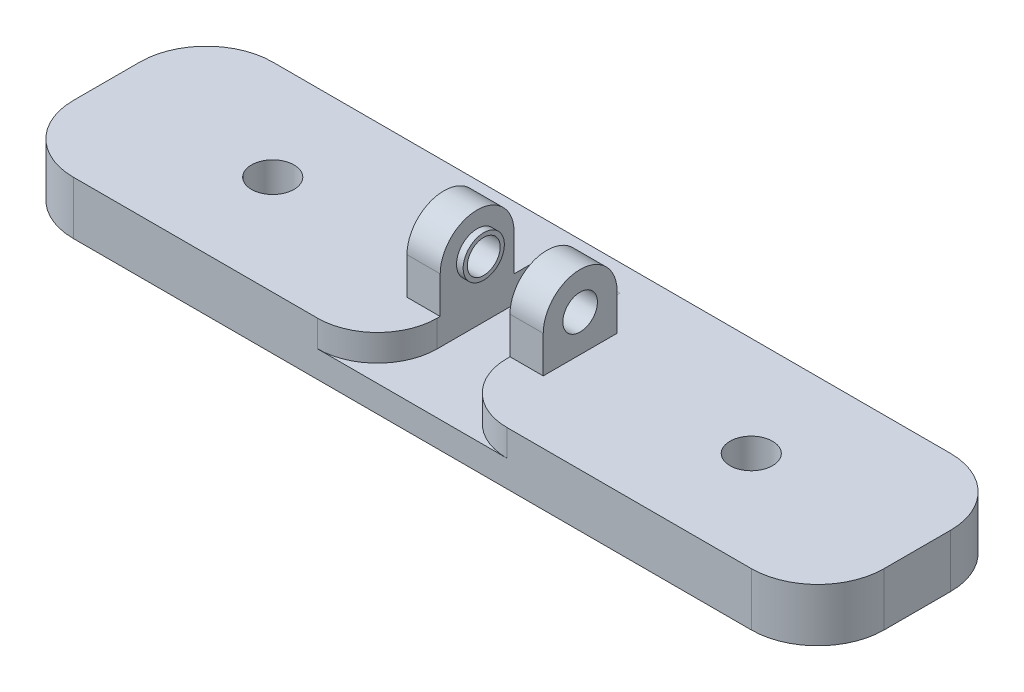
ISO-10303-21;
HEADER;
FILE_DESCRIPTION(('STEP AP214'),'2;1');
FILE_NAME('part.step','',(''),(''),'','','');
FILE_SCHEMA(('AUTOMOTIVE_DESIGN { 1 0 10303 214 1 1 1 1 }'));
ENDSEC;
DATA;
#1=APPLICATION_CONTEXT('core data for automotive mechanical design processes');
#2=APPLICATION_PROTOCOL_DEFINITION('international standard','automotive_design',2000,#1);
#3=PRODUCT_CONTEXT('',#1,'mechanical');
#4=PRODUCT('Part','Part','',(#3));
#5=PRODUCT_RELATED_PRODUCT_CATEGORY('part','',(#4));
#6=PRODUCT_DEFINITION_FORMATION('','',#4);
#7=PRODUCT_DEFINITION_CONTEXT('part definition',#1,'design');
#8=PRODUCT_DEFINITION('design','',#6,#7);
#9=PRODUCT_DEFINITION_SHAPE('','',#8);
#10=(LENGTH_UNIT() NAMED_UNIT(*) SI_UNIT(.MILLI.,.METRE.));
#11=(NAMED_UNIT(*) PLANE_ANGLE_UNIT() SI_UNIT($,.RADIAN.));
#12=(NAMED_UNIT(*) SI_UNIT($,.STERADIAN.) SOLID_ANGLE_UNIT());
#13=UNCERTAINTY_MEASURE_WITH_UNIT(LENGTH_MEASURE(1.E-05),#10,'distance_accuracy_value','');
#14=(GEOMETRIC_REPRESENTATION_CONTEXT(3) GLOBAL_UNCERTAINTY_ASSIGNED_CONTEXT((#13)) GLOBAL_UNIT_ASSIGNED_CONTEXT((#10,
#11,#12)) REPRESENTATION_CONTEXT('',''));
#15=CARTESIAN_POINT('',(0.,0.,0.));
#16=DIRECTION('',(0.,0.,1.));
#17=DIRECTION('',(1.,0.,0.));
#18=AXIS2_PLACEMENT_3D('',#15,#16,#17);
#19=CARTESIAN_POINT('',(-5.25,13.552198,0.));
#20=DIRECTION('',(1.,0.,0.));
#21=DIRECTION('',(0.,0.,-1.));
#22=AXIS2_PLACEMENT_3D('',#19,#20,#21);
#23=PLANE('',#22);
#24=DIRECTION('',(0.,0.,1.));
#25=VECTOR('',#24,1.);
#26=CARTESIAN_POINT('',(-5.25,8.,-9.00000000000001));
#27=LINE('',#26,#25);
#28=CARTESIAN_POINT('',(-5.25,8.,5.552198));
#29=VERTEX_POINT('',#28);
#30=CARTESIAN_POINT('',(-5.25,8.,5.99999999999999));
#31=VERTEX_POINT('',#30);
#32=EDGE_CURVE('E234',#29,#31,#27,.T.);
#33=ORIENTED_EDGE('',*,*,#32,.T.);
#34=DIRECTION('',(0.,1.,0.));
#35=VECTOR('',#34,1.);
#36=CARTESIAN_POINT('',(-5.25,4.,5.99999999999999));
#37=LINE('',#36,#35);
#38=CARTESIAN_POINT('',(-5.25,4.,5.99999999999999));
#39=VERTEX_POINT('',#38);
#40=EDGE_CURVE('E436',#31,#39,#37,.F.);
#41=ORIENTED_EDGE('',*,*,#40,.T.);
#42=DIRECTION('',(0.,0.,1.));
#43=VECTOR('',#42,1.);
#44=CARTESIAN_POINT('',(-5.25,4.,-9.00000000000001));
#45=LINE('',#44,#43);
#46=CARTESIAN_POINT('',(-5.25,4.,-9.00000000000001));
#47=VERTEX_POINT('',#46);
#48=EDGE_CURVE('E238',#47,#39,#45,.T.);
#49=ORIENTED_EDGE('',*,*,#48,.F.);
#50=DIRECTION('',(0.,1.,0.));
#51=VECTOR('',#50,1.);
#52=CARTESIAN_POINT('',(-5.25,4.,-9.00000000000001));
#53=LINE('',#52,#51);
#54=CARTESIAN_POINT('',(-5.25,6.,-9.00000000000001));
#55=VERTEX_POINT('',#54);
#56=EDGE_CURVE('E223',#47,#55,#53,.T.);
#57=ORIENTED_EDGE('',*,*,#56,.T.);
#58=CARTESIAN_POINT('',(-5.25,6.,-11.));
#59=DIRECTION('',(1.,0.,0.));
#60=DIRECTION('',(0.,0.,-1.));
#61=AXIS2_PLACEMENT_3D('',#58,#59,#60);
#62=CIRCLE('',#61,2.);
#63=CARTESIAN_POINT('',(-5.25,8.,-11.));
#64=VERTEX_POINT('',#63);
#65=EDGE_CURVE('E55',#55,#64,#62,.F.);
#66=ORIENTED_EDGE('',*,*,#65,.T.);
#67=CARTESIAN_POINT('',(-5.25,8.,-5.552198));
#68=VERTEX_POINT('',#67);
#69=EDGE_CURVE('E62',#64,#68,#27,.T.);
#70=ORIENTED_EDGE('',*,*,#69,.T.);
#71=DIRECTION('',(0.,1.,0.));
#72=VECTOR('',#71,1.);
#73=CARTESIAN_POINT('',(-5.25,8.,-5.552198));
#74=LINE('',#73,#72);
#75=CARTESIAN_POINT('',(-5.25,13.552198,-5.552198));
#76=VERTEX_POINT('',#75);
#77=EDGE_CURVE('E251',#68,#76,#74,.T.);
#78=ORIENTED_EDGE('',*,*,#77,.T.);
#79=CARTESIAN_POINT('',(-5.25,13.552198,0.));
#80=DIRECTION('',(1.,0.,0.));
#81=DIRECTION('',(0.,0.,-1.));
#82=AXIS2_PLACEMENT_3D('',#79,#80,#81);
#83=CIRCLE('',#82,5.552198);
#84=CARTESIAN_POINT('',(-5.25,13.552198,5.552198));
#85=VERTEX_POINT('',#84);
#86=EDGE_CURVE('E245',#76,#85,#83,.T.);
#87=ORIENTED_EDGE('',*,*,#86,.T.);
#88=DIRECTION('',(0.,-1.,0.));
#89=VECTOR('',#88,1.);
#90=CARTESIAN_POINT('',(-5.25,13.552198,5.552198));
#91=LINE('',#90,#89);
#92=EDGE_CURVE('E266',#85,#29,#91,.T.);
#93=ORIENTED_EDGE('',*,*,#92,.T.);
#94=EDGE_LOOP('',(#33,#41,#49,#57,#66,#70,#78,#87,#93));
#95=FACE_BOUND('',#94,.T.);
#96=CARTESIAN_POINT('',(-5.25,13.552198,0.));
#97=DIRECTION('',(1.,0.,0.));
#98=DIRECTION('',(0.,0.,-1.));
#99=AXIS2_PLACEMENT_3D('',#96,#97,#98);
#100=CIRCLE('',#99,3.1);
#101=CARTESIAN_POINT('',(-5.25,13.552198,-3.1));
#102=VERTEX_POINT('',#101);
#103=EDGE_CURVE('E600',#102,#102,#100,.T.);
#104=ORIENTED_EDGE('',*,*,#103,.F.);
#105=EDGE_LOOP('',(#104));
#106=FACE_BOUND('',#105,.T.);
#107=ADVANCED_FACE('F46',(#95,#106),#23,.T.);
#108=CARTESIAN_POINT('',(5.25,13.552198,0.));
#109=DIRECTION('',(1.,0.,0.));
#110=DIRECTION('',(0.,0.,-1.));
#111=AXIS2_PLACEMENT_3D('',#108,#109,#110);
#112=PLANE('',#111);
#113=DIRECTION('',(0.,0.,-1.));
#114=VECTOR('',#113,1.);
#115=CARTESIAN_POINT('',(5.25,4.,-9.00000000000001));
#116=LINE('',#115,#114);
#117=CARTESIAN_POINT('',(5.25,4.,6.));
#118=VERTEX_POINT('',#117);
#119=CARTESIAN_POINT('',(5.25,4.,-9.00000000000001));
#120=VERTEX_POINT('',#119);
#121=EDGE_CURVE('E201',#118,#120,#116,.T.);
#122=ORIENTED_EDGE('',*,*,#121,.F.);
#123=DIRECTION('',(0.,1.,0.));
#124=VECTOR('',#123,1.);
#125=CARTESIAN_POINT('',(5.25,13.552198,6.));
#126=LINE('',#125,#124);
#127=CARTESIAN_POINT('',(5.25,8.,6.));
#128=VERTEX_POINT('',#127);
#129=EDGE_CURVE('E419',#118,#128,#126,.T.);
#130=ORIENTED_EDGE('',*,*,#129,.T.);
#131=DIRECTION('',(0.,0.,-1.));
#132=VECTOR('',#131,1.);
#133=CARTESIAN_POINT('',(5.25,8.,-9.00000000000001));
#134=LINE('',#133,#132);
#135=CARTESIAN_POINT('',(5.25,8.,5.552198));
#136=VERTEX_POINT('',#135);
#137=EDGE_CURVE('E235',#128,#136,#134,.T.);
#138=ORIENTED_EDGE('',*,*,#137,.T.);
#139=DIRECTION('',(0.,-1.,0.));
#140=VECTOR('',#139,1.);
#141=CARTESIAN_POINT('',(5.25,13.552198,5.552198));
#142=LINE('',#141,#140);
#143=CARTESIAN_POINT('',(5.25,13.552198,5.552198));
#144=VERTEX_POINT('',#143);
#145=EDGE_CURVE('E308',#144,#136,#142,.T.);
#146=ORIENTED_EDGE('',*,*,#145,.F.);
#147=CARTESIAN_POINT('',(5.25,13.552198,0.));
#148=DIRECTION('',(1.,0.,0.));
#149=DIRECTION('',(0.,0.,-1.));
#150=AXIS2_PLACEMENT_3D('',#147,#148,#149);
#151=CIRCLE('',#150,5.552198);
#152=CARTESIAN_POINT('',(5.25,13.552198,-5.552198));
#153=VERTEX_POINT('',#152);
#154=EDGE_CURVE('E289',#153,#144,#151,.T.);
#155=ORIENTED_EDGE('',*,*,#154,.F.);
#156=DIRECTION('',(0.,1.,0.));
#157=VECTOR('',#156,1.);
#158=CARTESIAN_POINT('',(5.25,8.,-5.552198));
#159=LINE('',#158,#157);
#160=CARTESIAN_POINT('',(5.25,8.,-5.552198));
#161=VERTEX_POINT('',#160);
#162=EDGE_CURVE('E295',#161,#153,#159,.T.);
#163=ORIENTED_EDGE('',*,*,#162,.F.);
#164=CARTESIAN_POINT('',(5.25,8.,-11.));
#165=VERTEX_POINT('',#164);
#166=EDGE_CURVE('E69',#161,#165,#134,.T.);
#167=ORIENTED_EDGE('',*,*,#166,.T.);
#168=CARTESIAN_POINT('',(5.25,6.,-11.));
#169=DIRECTION('',(1.,0.,0.));
#170=DIRECTION('',(0.,0.,-1.));
#171=AXIS2_PLACEMENT_3D('',#168,#169,#170);
#172=CIRCLE('',#171,2.);
#173=CARTESIAN_POINT('',(5.25,6.,-9.00000000000001));
#174=VERTEX_POINT('',#173);
#175=EDGE_CURVE('E11',#165,#174,#172,.T.);
#176=ORIENTED_EDGE('',*,*,#175,.T.);
#177=DIRECTION('',(0.,1.,0.));
#178=VECTOR('',#177,1.);
#179=CARTESIAN_POINT('',(5.25,4.,-9.00000000000001));
#180=LINE('',#179,#178);
#181=EDGE_CURVE('E215',#120,#174,#180,.T.);
#182=ORIENTED_EDGE('',*,*,#181,.F.);
#183=EDGE_LOOP('',(#122,#130,#138,#146,#155,#163,#167,#176,#182));
#184=FACE_BOUND('',#183,.T.);
#185=CARTESIAN_POINT('',(5.25,13.552198,0.));
#186=DIRECTION('',(1.,0.,0.));
#187=DIRECTION('',(0.,0.,-1.));
#188=AXIS2_PLACEMENT_3D('',#185,#186,#187);
#189=CIRCLE('',#188,3.1);
#190=CARTESIAN_POINT('',(5.25,13.552198,-3.1));
#191=VERTEX_POINT('',#190);
#192=EDGE_CURVE('E348',#191,#191,#189,.F.);
#193=ORIENTED_EDGE('',*,*,#192,.F.);
#194=EDGE_LOOP('',(#193));
#195=FACE_BOUND('',#194,.T.);
#196=ADVANCED_FACE('F216',(#184,#195),#112,.F.);
#197=CARTESIAN_POINT('',(0.,8.,0.));
#198=DIRECTION('',(0.,1.,0.));
#199=DIRECTION('',(0.,0.,1.));
#200=AXIS2_PLACEMENT_3D('',#197,#198,#199);
#201=PLANE('',#200);
#202=CARTESIAN_POINT('',(-36.,8.,0.));
#203=DIRECTION('',(0.,1.,0.));
#204=DIRECTION('',(0.,0.,1.));
#205=AXIS2_PLACEMENT_3D('',#202,#203,#204);
#206=CIRCLE('',#205,3.2);
#207=CARTESIAN_POINT('',(-36.,8.,3.2));
#208=VERTEX_POINT('',#207);
#209=EDGE_CURVE('E594',#208,#208,#206,.T.);
#210=ORIENTED_EDGE('',*,*,#209,.F.);
#211=EDGE_LOOP('',(#210));
#212=FACE_BOUND('',#211,.T.);
#213=CARTESIAN_POINT('',(36.,8.,0.));
#214=DIRECTION('',(0.,1.,0.));
#215=DIRECTION('',(0.,0.,-1.));
#216=AXIS2_PLACEMENT_3D('',#213,#214,#215);
#217=CIRCLE('',#216,3.2);
#218=CARTESIAN_POINT('',(36.,8.,-3.2));
#219=VERTEX_POINT('',#218);
#220=EDGE_CURVE('E589',#219,#219,#217,.T.);
#221=ORIENTED_EDGE('',*,*,#220,.F.);
#222=EDGE_LOOP('',(#221));
#223=FACE_BOUND('',#222,.T.);
#224=ORIENTED_EDGE('',*,*,#69,.F.);
#225=DIRECTION('',(-1.,0.,0.));
#226=VECTOR('',#225,1.);
#227=CARTESIAN_POINT('',(5.25,8.,-11.));
#228=LINE('',#227,#226);
#229=EDGE_CURVE('E448',#64,#165,#228,.F.);
#230=ORIENTED_EDGE('',*,*,#229,.T.);
#231=ORIENTED_EDGE('',*,*,#166,.F.);
#232=DIRECTION('',(-1.,0.,0.));
#233=VECTOR('',#232,1.);
#234=CARTESIAN_POINT('',(10.25,8.,-5.552198));
#235=LINE('',#234,#233);
#236=CARTESIAN_POINT('',(10.25,8.,-5.552198));
#237=VERTEX_POINT('',#236);
#238=EDGE_CURVE('E317',#237,#161,#235,.T.);
#239=ORIENTED_EDGE('',*,*,#238,.F.);
#240=DIRECTION('',(0.,0.,-1.));
#241=VECTOR('',#240,1.);
#242=CARTESIAN_POINT('',(10.25,8.,5.552198));
#243=LINE('',#242,#241);
#244=CARTESIAN_POINT('',(10.25,8.,5.552198));
#245=VERTEX_POINT('',#244);
#246=EDGE_CURVE('E298',#245,#237,#243,.T.);
#247=ORIENTED_EDGE('',*,*,#246,.F.);
#248=DIRECTION('',(-1.,0.,0.));
#249=VECTOR('',#248,1.);
#250=CARTESIAN_POINT('',(10.25,8.,5.552198));
#251=LINE('',#250,#249);
#252=EDGE_CURVE('E321',#245,#136,#251,.T.);
#253=ORIENTED_EDGE('',*,*,#252,.T.);
#254=ORIENTED_EDGE('',*,*,#137,.F.);
#255=CARTESIAN_POINT('',(14.25,8.,6.));
#256=DIRECTION('',(0.,1.,0.));
#257=DIRECTION('',(0.,0.,1.));
#258=AXIS2_PLACEMENT_3D('',#255,#256,#257);
#259=CIRCLE('',#258,9.);
#260=CARTESIAN_POINT('',(14.25,8.,15.));
#261=VERTEX_POINT('',#260);
#262=EDGE_CURVE('E425',#128,#261,#259,.T.);
#263=ORIENTED_EDGE('',*,*,#262,.T.);
#264=DIRECTION('',(1.,0.,0.));
#265=VECTOR('',#264,1.);
#266=CARTESIAN_POINT('',(-61.,8.,15.));
#267=LINE('',#266,#265);
#268=CARTESIAN_POINT('',(51.,8.,15.));
#269=VERTEX_POINT('',#268);
#270=EDGE_CURVE('E343',#261,#269,#267,.T.);
#271=ORIENTED_EDGE('',*,*,#270,.T.);
#272=CARTESIAN_POINT('',(51.,8.,4.99999999999999));
#273=DIRECTION('',(0.,1.,0.));
#274=DIRECTION('',(0.,0.,1.));
#275=AXIS2_PLACEMENT_3D('',#272,#273,#274);
#276=CIRCLE('',#275,10.);
#277=CARTESIAN_POINT('',(61.,8.,4.99999999999999));
#278=VERTEX_POINT('',#277);
#279=EDGE_CURVE('E392',#269,#278,#276,.T.);
#280=ORIENTED_EDGE('',*,*,#279,.T.);
#281=DIRECTION('',(0.,0.,-1.));
#282=VECTOR('',#281,1.);
#283=CARTESIAN_POINT('',(61.,8.,-15.));
#284=LINE('',#283,#282);
#285=CARTESIAN_POINT('',(61.,8.,-5.00000000000001));
#286=VERTEX_POINT('',#285);
#287=EDGE_CURVE('E330',#278,#286,#284,.T.);
#288=ORIENTED_EDGE('',*,*,#287,.T.);
#289=CARTESIAN_POINT('',(51.,8.,-5.));
#290=DIRECTION('',(0.,1.,0.));
#291=DIRECTION('',(0.,0.,1.));
#292=AXIS2_PLACEMENT_3D('',#289,#290,#291);
#293=CIRCLE('',#292,10.);
#294=CARTESIAN_POINT('',(51.,8.,-15.));
#295=VERTEX_POINT('',#294);
#296=EDGE_CURVE('E395',#286,#295,#293,.T.);
#297=ORIENTED_EDGE('',*,*,#296,.T.);
#298=DIRECTION('',(-1.,0.,0.));
#299=VECTOR('',#298,1.);
#300=CARTESIAN_POINT('',(-61.,8.,-15.));
#301=LINE('',#300,#299);
#302=CARTESIAN_POINT('',(-51.,8.,-15.));
#303=VERTEX_POINT('',#302);
#304=EDGE_CURVE('E334',#295,#303,#301,.T.);
#305=ORIENTED_EDGE('',*,*,#304,.T.);
#306=CARTESIAN_POINT('',(-51.,8.,-5.));
#307=DIRECTION('',(0.,1.,0.));
#308=DIRECTION('',(0.,0.,1.));
#309=AXIS2_PLACEMENT_3D('',#306,#307,#308);
#310=CIRCLE('',#309,10.);
#311=CARTESIAN_POINT('',(-61.,8.,-5.));
#312=VERTEX_POINT('',#311);
#313=EDGE_CURVE('E401',#303,#312,#310,.T.);
#314=ORIENTED_EDGE('',*,*,#313,.T.);
#315=DIRECTION('',(0.,0.,1.));
#316=VECTOR('',#315,1.);
#317=CARTESIAN_POINT('',(-61.,8.,-15.));
#318=LINE('',#317,#316);
#319=CARTESIAN_POINT('',(-61.,8.,5.));
#320=VERTEX_POINT('',#319);
#321=EDGE_CURVE('E339',#312,#320,#318,.T.);
#322=ORIENTED_EDGE('',*,*,#321,.T.);
#323=CARTESIAN_POINT('',(-51.,8.,5.));
#324=DIRECTION('',(0.,1.,0.));
#325=DIRECTION('',(0.,0.,1.));
#326=AXIS2_PLACEMENT_3D('',#323,#324,#325);
#327=CIRCLE('',#326,10.);
#328=CARTESIAN_POINT('',(-51.,8.,15.));
#329=VERTEX_POINT('',#328);
#330=EDGE_CURVE('E398',#320,#329,#327,.T.);
#331=ORIENTED_EDGE('',*,*,#330,.T.);
#332=CARTESIAN_POINT('',(-14.25,8.,15.));
#333=VERTEX_POINT('',#332);
#334=EDGE_CURVE('E344',#329,#333,#267,.T.);
#335=ORIENTED_EDGE('',*,*,#334,.T.);
#336=CARTESIAN_POINT('',(-14.25,8.,6.));
#337=DIRECTION('',(0.,1.,0.));
#338=DIRECTION('',(0.,0.,1.));
#339=AXIS2_PLACEMENT_3D('',#336,#337,#338);
#340=CIRCLE('',#339,9.);
#341=EDGE_CURVE('E422',#333,#31,#340,.T.);
#342=ORIENTED_EDGE('',*,*,#341,.T.);
#343=ORIENTED_EDGE('',*,*,#32,.F.);
#344=DIRECTION('',(1.,0.,0.));
#345=VECTOR('',#344,1.);
#346=CARTESIAN_POINT('',(-10.25,8.,5.552198));
#347=LINE('',#346,#345);
#348=CARTESIAN_POINT('',(-10.25,8.,5.552198));
#349=VERTEX_POINT('',#348);
#350=EDGE_CURVE('E280',#349,#29,#347,.T.);
#351=ORIENTED_EDGE('',*,*,#350,.F.);
#352=DIRECTION('',(0.,0.,-1.));
#353=VECTOR('',#352,1.);
#354=CARTESIAN_POINT('',(-10.25,8.,5.552198));
#355=LINE('',#354,#353);
#356=CARTESIAN_POINT('',(-10.25,8.,-5.552198));
#357=VERTEX_POINT('',#356);
#358=EDGE_CURVE('E255',#349,#357,#355,.T.);
#359=ORIENTED_EDGE('',*,*,#358,.T.);
#360=DIRECTION('',(1.,0.,0.));
#361=VECTOR('',#360,1.);
#362=CARTESIAN_POINT('',(-10.25,8.,-5.552198));
#363=LINE('',#362,#361);
#364=EDGE_CURVE('E277',#357,#68,#363,.T.);
#365=ORIENTED_EDGE('',*,*,#364,.T.);
#366=EDGE_LOOP('',(#224,#230,#231,#239,#247,#253,#254,#263,#271,#280,#288,#297,#305,#314,#322,
#331,#335,#342,#343,#351,#359,#365));
#367=FACE_BOUND('',#366,.T.);
#368=ADVANCED_FACE('F456',(#212,#223,#367),#201,.T.);
#369=CARTESIAN_POINT('',(61.,8.,-15.));
#370=DIRECTION('',(-1.,0.,0.));
#371=DIRECTION('',(0.,0.,1.));
#372=AXIS2_PLACEMENT_3D('',#369,#370,#371);
#373=PLANE('',#372);
#374=DIRECTION('',(0.,0.,-1.));
#375=VECTOR('',#374,1.);
#376=CARTESIAN_POINT('',(61.,0.,-15.));
#377=LINE('',#376,#375);
#378=CARTESIAN_POINT('',(61.,0.,4.99999999999999));
#379=VERTEX_POINT('',#378);
#380=CARTESIAN_POINT('',(61.,0.,-5.00000000000001));
#381=VERTEX_POINT('',#380);
#382=EDGE_CURVE('E329',#379,#381,#377,.T.);
#383=ORIENTED_EDGE('',*,*,#382,.T.);
#384=DIRECTION('',(0.,-1.,0.));
#385=VECTOR('',#384,1.);
#386=CARTESIAN_POINT('',(61.,8.,-5.00000000000001));
#387=LINE('',#386,#385);
#388=EDGE_CURVE('E416',#381,#286,#387,.F.);
#389=ORIENTED_EDGE('',*,*,#388,.T.);
#390=ORIENTED_EDGE('',*,*,#287,.F.);
#391=DIRECTION('',(0.,-1.,0.));
#392=VECTOR('',#391,1.);
#393=CARTESIAN_POINT('',(61.,8.,4.99999999999999));
#394=LINE('',#393,#392);
#395=EDGE_CURVE('E412',#278,#379,#394,.T.);
#396=ORIENTED_EDGE('',*,*,#395,.T.);
#397=EDGE_LOOP('',(#383,#389,#390,#396));
#398=FACE_BOUND('',#397,.T.);
#399=ADVANCED_FACE('F538',(#398),#373,.F.);
#400=CARTESIAN_POINT('',(-61.,8.,-15.));
#401=DIRECTION('',(0.,0.,1.));
#402=DIRECTION('',(1.,0.,0.));
#403=AXIS2_PLACEMENT_3D('',#400,#401,#402);
#404=PLANE('',#403);
#405=DIRECTION('',(-1.,0.,0.));
#406=VECTOR('',#405,1.);
#407=CARTESIAN_POINT('',(-61.,0.,-15.));
#408=LINE('',#407,#406);
#409=CARTESIAN_POINT('',(51.,0.,-15.));
#410=VERTEX_POINT('',#409);
#411=CARTESIAN_POINT('',(-51.,0.,-15.));
#412=VERTEX_POINT('',#411);
#413=EDGE_CURVE('E352',#410,#412,#408,.T.);
#414=ORIENTED_EDGE('',*,*,#413,.T.);
#415=DIRECTION('',(0.,-1.,0.));
#416=VECTOR('',#415,1.);
#417=CARTESIAN_POINT('',(-51.,8.,-15.));
#418=LINE('',#417,#416);
#419=EDGE_CURVE('E389',#412,#303,#418,.F.);
#420=ORIENTED_EDGE('',*,*,#419,.T.);
#421=ORIENTED_EDGE('',*,*,#304,.F.);
#422=DIRECTION('',(0.,-1.,0.));
#423=VECTOR('',#422,1.);
#424=CARTESIAN_POINT('',(51.,8.,-15.));
#425=LINE('',#424,#423);
#426=EDGE_CURVE('E385',#295,#410,#425,.T.);
#427=ORIENTED_EDGE('',*,*,#426,.T.);
#428=EDGE_LOOP('',(#414,#420,#421,#427));
#429=FACE_BOUND('',#428,.T.);
#430=ADVANCED_FACE('F534',(#429),#404,.F.);
#431=CARTESIAN_POINT('',(-61.,8.,-15.));
#432=DIRECTION('',(1.,0.,0.));
#433=DIRECTION('',(0.,0.,-1.));
#434=AXIS2_PLACEMENT_3D('',#431,#432,#433);
#435=PLANE('',#434);
#436=ORIENTED_EDGE('',*,*,#321,.F.);
#437=DIRECTION('',(0.,-1.,0.));
#438=VECTOR('',#437,1.);
#439=CARTESIAN_POINT('',(-61.,8.,-5.));
#440=LINE('',#439,#438);
#441=CARTESIAN_POINT('',(-61.,0.,-5.));
#442=VERTEX_POINT('',#441);
#443=EDGE_CURVE('E369',#312,#442,#440,.T.);
#444=ORIENTED_EDGE('',*,*,#443,.T.);
#445=DIRECTION('',(0.,0.,1.));
#446=VECTOR('',#445,1.);
#447=CARTESIAN_POINT('',(-61.,0.,-15.));
#448=LINE('',#447,#446);
#449=CARTESIAN_POINT('',(-61.,0.,5.));
#450=VERTEX_POINT('',#449);
#451=EDGE_CURVE('E356',#442,#450,#448,.T.);
#452=ORIENTED_EDGE('',*,*,#451,.T.);
#453=DIRECTION('',(0.,-1.,0.));
#454=VECTOR('',#453,1.);
#455=CARTESIAN_POINT('',(-61.,8.,5.));
#456=LINE('',#455,#454);
#457=EDGE_CURVE('E366',#450,#320,#456,.F.);
#458=ORIENTED_EDGE('',*,*,#457,.T.);
#459=EDGE_LOOP('',(#436,#444,#452,#458));
#460=FACE_BOUND('',#459,.T.);
#461=ADVANCED_FACE('F525',(#460),#435,.F.);
#462=CARTESIAN_POINT('',(-61.,8.,15.));
#463=DIRECTION('',(0.,0.,-1.));
#464=DIRECTION('',(-1.,0.,0.));
#465=AXIS2_PLACEMENT_3D('',#462,#463,#464);
#466=PLANE('',#465);
#467=ORIENTED_EDGE('',*,*,#270,.F.);
#468=DIRECTION('',(0.,1.,0.));
#469=VECTOR('',#468,1.);
#470=CARTESIAN_POINT('',(14.25,8.,15.));
#471=LINE('',#470,#469);
#472=CARTESIAN_POINT('',(14.25,4.,15.));
#473=VERTEX_POINT('',#472);
#474=EDGE_CURVE('E432',#261,#473,#471,.F.);
#475=ORIENTED_EDGE('',*,*,#474,.T.);
#476=DIRECTION('',(1.,0.,0.));
#477=VECTOR('',#476,1.);
#478=CARTESIAN_POINT('',(-5.25,4.,15.));
#479=LINE('',#478,#477);
#480=CARTESIAN_POINT('',(-14.25,4.,15.));
#481=VERTEX_POINT('',#480);
#482=EDGE_CURVE('E212',#481,#473,#479,.T.);
#483=ORIENTED_EDGE('',*,*,#482,.F.);
#484=DIRECTION('',(0.,1.,0.));
#485=VECTOR('',#484,1.);
#486=CARTESIAN_POINT('',(-14.25,8.,15.));
#487=LINE('',#486,#485);
#488=EDGE_CURVE('E428',#481,#333,#487,.T.);
#489=ORIENTED_EDGE('',*,*,#488,.T.);
#490=ORIENTED_EDGE('',*,*,#334,.F.);
#491=DIRECTION('',(0.,-1.,0.));
#492=VECTOR('',#491,1.);
#493=CARTESIAN_POINT('',(-51.,8.,15.));
#494=LINE('',#493,#492);
#495=CARTESIAN_POINT('',(-51.,0.,15.));
#496=VERTEX_POINT('',#495);
#497=EDGE_CURVE('E408',#329,#496,#494,.T.);
#498=ORIENTED_EDGE('',*,*,#497,.T.);
#499=DIRECTION('',(1.,0.,0.));
#500=VECTOR('',#499,1.);
#501=CARTESIAN_POINT('',(-61.,0.,15.));
#502=LINE('',#501,#500);
#503=CARTESIAN_POINT('',(51.,0.,15.));
#504=VERTEX_POINT('',#503);
#505=EDGE_CURVE('E335',#496,#504,#502,.T.);
#506=ORIENTED_EDGE('',*,*,#505,.T.);
#507=DIRECTION('',(0.,-1.,0.));
#508=VECTOR('',#507,1.);
#509=CARTESIAN_POINT('',(51.,8.,15.));
#510=LINE('',#509,#508);
#511=EDGE_CURVE('E404',#504,#269,#510,.F.);
#512=ORIENTED_EDGE('',*,*,#511,.T.);
#513=EDGE_LOOP('',(#467,#475,#483,#489,#490,#498,#506,#512));
#514=FACE_BOUND('',#513,.T.);
#515=ADVANCED_FACE('F517',(#514),#466,.F.);
#516=CARTESIAN_POINT('',(0.,0.,0.));
#517=DIRECTION('',(0.,1.,0.));
#518=DIRECTION('',(0.,0.,1.));
#519=AXIS2_PLACEMENT_3D('',#516,#517,#518);
#520=PLANE('',#519);
#521=CARTESIAN_POINT('',(-36.,0.,0.));
#522=DIRECTION('',(0.,1.,0.));
#523=DIRECTION('',(0.,0.,1.));
#524=AXIS2_PLACEMENT_3D('',#521,#522,#523);
#525=CIRCLE('',#524,3.2);
#526=CARTESIAN_POINT('',(-36.,0.,3.2));
#527=VERTEX_POINT('',#526);
#528=EDGE_CURVE('E584',#527,#527,#525,.T.);
#529=ORIENTED_EDGE('',*,*,#528,.T.);
#530=EDGE_LOOP('',(#529));
#531=FACE_BOUND('',#530,.T.);
#532=CARTESIAN_POINT('',(36.,0.,0.));
#533=DIRECTION('',(0.,1.,0.));
#534=DIRECTION('',(0.,0.,-1.));
#535=AXIS2_PLACEMENT_3D('',#532,#533,#534);
#536=CIRCLE('',#535,3.2);
#537=CARTESIAN_POINT('',(36.,0.,-3.2));
#538=VERTEX_POINT('',#537);
#539=EDGE_CURVE('E585',#538,#538,#536,.T.);
#540=ORIENTED_EDGE('',*,*,#539,.T.);
#541=EDGE_LOOP('',(#540));
#542=FACE_BOUND('',#541,.T.);
#543=ORIENTED_EDGE('',*,*,#451,.F.);
#544=CARTESIAN_POINT('',(-51.,0.,-5.));
#545=DIRECTION('',(0.,1.,0.));
#546=DIRECTION('',(0.,0.,1.));
#547=AXIS2_PLACEMENT_3D('',#544,#545,#546);
#548=CIRCLE('',#547,10.);
#549=EDGE_CURVE('E382',#442,#412,#548,.F.);
#550=ORIENTED_EDGE('',*,*,#549,.T.);
#551=ORIENTED_EDGE('',*,*,#413,.F.);
#552=CARTESIAN_POINT('',(51.,0.,-5.));
#553=DIRECTION('',(0.,1.,0.));
#554=DIRECTION('',(0.,0.,1.));
#555=AXIS2_PLACEMENT_3D('',#552,#553,#554);
#556=CIRCLE('',#555,10.);
#557=EDGE_CURVE('E376',#410,#381,#556,.F.);
#558=ORIENTED_EDGE('',*,*,#557,.T.);
#559=ORIENTED_EDGE('',*,*,#382,.F.);
#560=CARTESIAN_POINT('',(51.,0.,4.99999999999999));
#561=DIRECTION('',(0.,1.,0.));
#562=DIRECTION('',(0.,0.,1.));
#563=AXIS2_PLACEMENT_3D('',#560,#561,#562);
#564=CIRCLE('',#563,10.);
#565=EDGE_CURVE('E373',#379,#504,#564,.F.);
#566=ORIENTED_EDGE('',*,*,#565,.T.);
#567=ORIENTED_EDGE('',*,*,#505,.F.);
#568=CARTESIAN_POINT('',(-51.,0.,5.));
#569=DIRECTION('',(0.,1.,0.));
#570=DIRECTION('',(0.,0.,1.));
#571=AXIS2_PLACEMENT_3D('',#568,#569,#570);
#572=CIRCLE('',#571,10.);
#573=EDGE_CURVE('E379',#496,#450,#572,.F.);
#574=ORIENTED_EDGE('',*,*,#573,.T.);
#575=EDGE_LOOP('',(#543,#550,#551,#558,#559,#566,#567,#574));
#576=FACE_BOUND('',#575,.T.);
#577=ADVANCED_FACE('F513',(#531,#542,#576),#520,.F.);
#578=CARTESIAN_POINT('',(10.25,13.552198,0.));
#579=DIRECTION('',(1.,0.,0.));
#580=DIRECTION('',(0.,0.,-1.));
#581=AXIS2_PLACEMENT_3D('',#578,#579,#580);
#582=PLANE('',#581);
#583=CARTESIAN_POINT('',(10.25,13.552198,0.));
#584=DIRECTION('',(1.,0.,0.));
#585=DIRECTION('',(0.,0.,-1.));
#586=AXIS2_PLACEMENT_3D('',#583,#584,#585);
#587=CIRCLE('',#586,5.552198);
#588=CARTESIAN_POINT('',(10.25,13.552198,-5.552198));
#589=VERTEX_POINT('',#588);
#590=CARTESIAN_POINT('',(10.25,13.552198,5.552198));
#591=VERTEX_POINT('',#590);
#592=EDGE_CURVE('E290',#589,#591,#587,.T.);
#593=ORIENTED_EDGE('',*,*,#592,.T.);
#594=DIRECTION('',(0.,-1.,0.));
#595=VECTOR('',#594,1.);
#596=CARTESIAN_POINT('',(10.25,13.552198,5.552198));
#597=LINE('',#596,#595);
#598=EDGE_CURVE('E294',#591,#245,#597,.T.);
#599=ORIENTED_EDGE('',*,*,#598,.T.);
#600=ORIENTED_EDGE('',*,*,#246,.T.);
#601=DIRECTION('',(0.,1.,0.));
#602=VECTOR('',#601,1.);
#603=CARTESIAN_POINT('',(10.25,8.,-5.552198));
#604=LINE('',#603,#602);
#605=EDGE_CURVE('E301',#237,#589,#604,.T.);
#606=ORIENTED_EDGE('',*,*,#605,.T.);
#607=EDGE_LOOP('',(#593,#599,#600,#606));
#608=FACE_BOUND('',#607,.T.);
#609=CARTESIAN_POINT('',(10.25,13.552198,0.));
#610=DIRECTION('',(1.,0.,0.));
#611=DIRECTION('',(0.,0.,-1.));
#612=AXIS2_PLACEMENT_3D('',#609,#610,#611);
#613=CIRCLE('',#612,2.6);
#614=CARTESIAN_POINT('',(10.25,13.552198,-2.6));
#615=VERTEX_POINT('',#614);
#616=EDGE_CURVE('E276',#615,#615,#613,.T.);
#617=ORIENTED_EDGE('',*,*,#616,.F.);
#618=EDGE_LOOP('',(#617));
#619=FACE_BOUND('',#618,.T.);
#620=ADVANCED_FACE('F470',(#608,#619),#582,.T.);
#621=CARTESIAN_POINT('',(10.25,13.552198,0.));
#622=DIRECTION('',(-1.,0.,0.));
#623=DIRECTION('',(0.,0.,1.));
#624=AXIS2_PLACEMENT_3D('',#621,#622,#623);
#625=CYLINDRICAL_SURFACE('',#624,5.552198);
#626=ORIENTED_EDGE('',*,*,#154,.T.);
#627=DIRECTION('',(-1.,0.,0.));
#628=VECTOR('',#627,1.);
#629=CARTESIAN_POINT('',(10.25,13.552198,5.552198));
#630=LINE('',#629,#628);
#631=EDGE_CURVE('E325',#591,#144,#630,.T.);
#632=ORIENTED_EDGE('',*,*,#631,.F.);
#633=ORIENTED_EDGE('',*,*,#592,.F.);
#634=DIRECTION('',(-1.,0.,0.));
#635=VECTOR('',#634,1.);
#636=CARTESIAN_POINT('',(10.25,13.552198,-5.552198));
#637=LINE('',#636,#635);
#638=EDGE_CURVE('E304',#589,#153,#637,.T.);
#639=ORIENTED_EDGE('',*,*,#638,.T.);
#640=EDGE_LOOP('',(#626,#632,#633,#639));
#641=FACE_BOUND('',#640,.T.);
#642=ADVANCED_FACE('F467',(#641),#625,.T.);
#643=CARTESIAN_POINT('',(10.25,13.552198,5.552198));
#644=DIRECTION('',(0.,0.,-1.));
#645=DIRECTION('',(0.,1.,0.));
#646=AXIS2_PLACEMENT_3D('',#643,#644,#645);
#647=PLANE('',#646);
#648=ORIENTED_EDGE('',*,*,#145,.T.);
#649=ORIENTED_EDGE('',*,*,#252,.F.);
#650=ORIENTED_EDGE('',*,*,#598,.F.);
#651=ORIENTED_EDGE('',*,*,#631,.T.);
#652=EDGE_LOOP('',(#648,#649,#650,#651));
#653=FACE_BOUND('',#652,.T.);
#654=ADVANCED_FACE('F475',(#653),#647,.F.);
#655=CARTESIAN_POINT('',(10.25,8.,-5.552198));
#656=DIRECTION('',(0.,0.,1.));
#657=DIRECTION('',(0.,-1.,0.));
#658=AXIS2_PLACEMENT_3D('',#655,#656,#657);
#659=PLANE('',#658);
#660=ORIENTED_EDGE('',*,*,#162,.T.);
#661=ORIENTED_EDGE('',*,*,#638,.F.);
#662=ORIENTED_EDGE('',*,*,#605,.F.);
#663=ORIENTED_EDGE('',*,*,#238,.T.);
#664=EDGE_LOOP('',(#660,#661,#662,#663));
#665=FACE_BOUND('',#664,.T.);
#666=ADVANCED_FACE('F462',(#665),#659,.F.);
#667=CARTESIAN_POINT('',(10.25,13.552198,0.));
#668=DIRECTION('',(-1.,0.,0.));
#669=DIRECTION('',(0.,0.,1.));
#670=AXIS2_PLACEMENT_3D('',#667,#668,#669);
#671=CYLINDRICAL_SURFACE('',#670,2.6);
#672=ORIENTED_EDGE('',*,*,#616,.T.);
#673=EDGE_LOOP('',(#672));
#674=FACE_BOUND('',#673,.T.);
#675=CARTESIAN_POINT('',(4.25,13.552198,0.));
#676=DIRECTION('',(-1.,0.,0.));
#677=DIRECTION('',(0.,0.,1.));
#678=AXIS2_PLACEMENT_3D('',#675,#676,#677);
#679=CIRCLE('',#678,2.6);
#680=CARTESIAN_POINT('',(4.25,13.552198,2.6));
#681=VERTEX_POINT('',#680);
#682=EDGE_CURVE('E580',#681,#681,#679,.T.);
#683=ORIENTED_EDGE('',*,*,#682,.T.);
#684=EDGE_LOOP('',(#683));
#685=FACE_BOUND('',#684,.T.);
#686=ADVANCED_FACE('F482',(#674,#685),#671,.F.);
#687=CARTESIAN_POINT('',(-10.25,13.552198,0.));
#688=DIRECTION('',(1.,0.,0.));
#689=DIRECTION('',(0.,0.,-1.));
#690=AXIS2_PLACEMENT_3D('',#687,#688,#689);
#691=CYLINDRICAL_SURFACE('',#690,5.552198);
#692=ORIENTED_EDGE('',*,*,#86,.F.);
#693=DIRECTION('',(1.,0.,0.));
#694=VECTOR('',#693,1.);
#695=CARTESIAN_POINT('',(-10.25,13.552198,-5.552198));
#696=LINE('',#695,#694);
#697=CARTESIAN_POINT('',(-10.25,13.552198,-5.552198));
#698=VERTEX_POINT('',#697);
#699=EDGE_CURVE('E273',#698,#76,#696,.T.);
#700=ORIENTED_EDGE('',*,*,#699,.F.);
#701=CARTESIAN_POINT('',(-10.25,13.552198,0.));
#702=DIRECTION('',(1.,0.,0.));
#703=DIRECTION('',(0.,0.,-1.));
#704=AXIS2_PLACEMENT_3D('',#701,#702,#703);
#705=CIRCLE('',#704,5.552198);
#706=CARTESIAN_POINT('',(-10.25,13.552198,5.552198));
#707=VERTEX_POINT('',#706);
#708=EDGE_CURVE('E246',#698,#707,#705,.T.);
#709=ORIENTED_EDGE('',*,*,#708,.T.);
#710=DIRECTION('',(1.,0.,0.));
#711=VECTOR('',#710,1.);
#712=CARTESIAN_POINT('',(-10.25,13.552198,5.552198));
#713=LINE('',#712,#711);
#714=EDGE_CURVE('E262',#707,#85,#713,.T.);
#715=ORIENTED_EDGE('',*,*,#714,.T.);
#716=EDGE_LOOP('',(#692,#700,#709,#715));
#717=FACE_BOUND('',#716,.T.);
#718=ADVANCED_FACE('F501',(#717),#691,.T.);
#719=CARTESIAN_POINT('',(-10.25,8.,-5.552198));
#720=DIRECTION('',(0.,0.,-1.));
#721=DIRECTION('',(-1.,0.,0.));
#722=AXIS2_PLACEMENT_3D('',#719,#720,#721);
#723=PLANE('',#722);
#724=ORIENTED_EDGE('',*,*,#77,.F.);
#725=ORIENTED_EDGE('',*,*,#364,.F.);
#726=DIRECTION('',(0.,1.,0.));
#727=VECTOR('',#726,1.);
#728=CARTESIAN_POINT('',(-10.25,8.,-5.552198));
#729=LINE('',#728,#727);
#730=EDGE_CURVE('E258',#357,#698,#729,.T.);
#731=ORIENTED_EDGE('',*,*,#730,.T.);
#732=ORIENTED_EDGE('',*,*,#699,.T.);
#733=EDGE_LOOP('',(#724,#725,#731,#732));
#734=FACE_BOUND('',#733,.T.);
#735=ADVANCED_FACE('F497',(#734),#723,.T.);
#736=CARTESIAN_POINT('',(-10.25,13.552198,5.552198));
#737=DIRECTION('',(0.,0.,1.));
#738=DIRECTION('',(1.,0.,0.));
#739=AXIS2_PLACEMENT_3D('',#736,#737,#738);
#740=PLANE('',#739);
#741=ORIENTED_EDGE('',*,*,#92,.F.);
#742=ORIENTED_EDGE('',*,*,#714,.F.);
#743=DIRECTION('',(0.,-1.,0.));
#744=VECTOR('',#743,1.);
#745=CARTESIAN_POINT('',(-10.25,13.552198,5.552198));
#746=LINE('',#745,#744);
#747=EDGE_CURVE('E250',#707,#349,#746,.T.);
#748=ORIENTED_EDGE('',*,*,#747,.T.);
#749=ORIENTED_EDGE('',*,*,#350,.T.);
#750=EDGE_LOOP('',(#741,#742,#748,#749));
#751=FACE_BOUND('',#750,.T.);
#752=ADVANCED_FACE('F500',(#751),#740,.T.);
#753=CARTESIAN_POINT('',(-10.25,13.552198,0.));
#754=DIRECTION('',(1.,0.,0.));
#755=DIRECTION('',(0.,0.,-1.));
#756=AXIS2_PLACEMENT_3D('',#753,#754,#755);
#757=PLANE('',#756);
#758=CARTESIAN_POINT('',(-10.25,13.552198,0.));
#759=DIRECTION('',(1.,0.,0.));
#760=DIRECTION('',(0.,0.,-1.));
#761=AXIS2_PLACEMENT_3D('',#758,#759,#760);
#762=CIRCLE('',#761,2.475);
#763=CARTESIAN_POINT('',(-10.25,13.552198,-2.475));
#764=VERTEX_POINT('',#763);
#765=EDGE_CURVE('E240',#764,#764,#762,.T.);
#766=ORIENTED_EDGE('',*,*,#765,.T.);
#767=EDGE_LOOP('',(#766));
#768=FACE_BOUND('',#767,.T.);
#769=ORIENTED_EDGE('',*,*,#708,.F.);
#770=ORIENTED_EDGE('',*,*,#730,.F.);
#771=ORIENTED_EDGE('',*,*,#358,.F.);
#772=ORIENTED_EDGE('',*,*,#747,.F.);
#773=EDGE_LOOP('',(#769,#770,#771,#772));
#774=FACE_BOUND('',#773,.T.);
#775=ADVANCED_FACE('F495',(#768,#774),#757,.F.);
#776=CARTESIAN_POINT('',(-10.25,13.552198,0.));
#777=DIRECTION('',(1.,0.,0.));
#778=DIRECTION('',(0.,0.,-1.));
#779=AXIS2_PLACEMENT_3D('',#776,#777,#778);
#780=CYLINDRICAL_SURFACE('',#779,2.475);
#781=ORIENTED_EDGE('',*,*,#765,.F.);
#782=EDGE_LOOP('',(#781));
#783=FACE_BOUND('',#782,.T.);
#784=CARTESIAN_POINT('',(-4.25,13.552198,0.));
#785=DIRECTION('',(1.,0.,0.));
#786=DIRECTION('',(0.,0.,-1.));
#787=AXIS2_PLACEMENT_3D('',#784,#785,#786);
#788=CIRCLE('',#787,2.475);
#789=CARTESIAN_POINT('',(-4.25,13.552198,-2.475));
#790=VERTEX_POINT('',#789);
#791=EDGE_CURVE('E604',#790,#790,#788,.T.);
#792=ORIENTED_EDGE('',*,*,#791,.T.);
#793=EDGE_LOOP('',(#792));
#794=FACE_BOUND('',#793,.T.);
#795=ADVANCED_FACE('F612',(#783,#794),#780,.F.);
#796=CARTESIAN_POINT('',(-5.25,4.,-9.00000000000001));
#797=DIRECTION('',(0.,0.,-1.));
#798=DIRECTION('',(-1.,0.,0.));
#799=AXIS2_PLACEMENT_3D('',#796,#797,#798);
#800=PLANE('',#799);
#801=ORIENTED_EDGE('',*,*,#181,.T.);
#802=DIRECTION('',(-1.,0.,0.));
#803=VECTOR('',#802,1.);
#804=CARTESIAN_POINT('',(-5.25,6.,-9.00000000000001));
#805=LINE('',#804,#803);
#806=EDGE_CURVE('E445',#174,#55,#805,.T.);
#807=ORIENTED_EDGE('',*,*,#806,.T.);
#808=ORIENTED_EDGE('',*,*,#56,.F.);
#809=DIRECTION('',(-1.,0.,0.));
#810=VECTOR('',#809,1.);
#811=CARTESIAN_POINT('',(-5.25,4.,-9.00000000000001));
#812=LINE('',#811,#810);
#813=EDGE_CURVE('E206',#120,#47,#812,.T.);
#814=ORIENTED_EDGE('',*,*,#813,.F.);
#815=EDGE_LOOP('',(#801,#807,#808,#814));
#816=FACE_BOUND('',#815,.T.);
#817=ADVANCED_FACE('F225',(#816),#800,.F.);
#818=CARTESIAN_POINT('',(0.,4.,0.));
#819=DIRECTION('',(0.,1.,0.));
#820=DIRECTION('',(0.,0.,1.));
#821=AXIS2_PLACEMENT_3D('',#818,#819,#820);
#822=PLANE('',#821);
#823=ORIENTED_EDGE('',*,*,#48,.T.);
#824=CARTESIAN_POINT('',(-14.25,4.,6.));
#825=DIRECTION('',(0.,1.,0.));
#826=DIRECTION('',(0.,0.,1.));
#827=AXIS2_PLACEMENT_3D('',#824,#825,#826);
#828=CIRCLE('',#827,9.);
#829=EDGE_CURVE('E441',#39,#481,#828,.F.);
#830=ORIENTED_EDGE('',*,*,#829,.T.);
#831=ORIENTED_EDGE('',*,*,#482,.T.);
#832=CARTESIAN_POINT('',(14.25,4.,6.));
#833=DIRECTION('',(0.,1.,0.));
#834=DIRECTION('',(0.,0.,1.));
#835=AXIS2_PLACEMENT_3D('',#832,#833,#834);
#836=CIRCLE('',#835,9.);
#837=EDGE_CURVE('E208',#473,#118,#836,.F.);
#838=ORIENTED_EDGE('',*,*,#837,.T.);
#839=ORIENTED_EDGE('',*,*,#121,.T.);
#840=ORIENTED_EDGE('',*,*,#813,.T.);
#841=EDGE_LOOP('',(#823,#830,#831,#838,#839,#840));
#842=FACE_BOUND('',#841,.T.);
#843=ADVANCED_FACE('F204',(#842),#822,.T.);
#844=CARTESIAN_POINT('',(4.25,13.552198,0.));
#845=DIRECTION('',(-1.,0.,0.));
#846=DIRECTION('',(0.,0.,1.));
#847=AXIS2_PLACEMENT_3D('',#844,#845,#846);
#848=PLANE('',#847);
#849=CARTESIAN_POINT('',(4.25,13.552198,0.));
#850=DIRECTION('',(-1.,0.,0.));
#851=DIRECTION('',(0.,0.,1.));
#852=AXIS2_PLACEMENT_3D('',#849,#850,#851);
#853=CIRCLE('',#852,3.1);
#854=CARTESIAN_POINT('',(4.25,13.552198,3.1));
#855=VERTEX_POINT('',#854);
#856=EDGE_CURVE('E576',#855,#855,#853,.T.);
#857=ORIENTED_EDGE('',*,*,#856,.T.);
#858=EDGE_LOOP('',(#857));
#859=FACE_BOUND('',#858,.T.);
#860=ORIENTED_EDGE('',*,*,#682,.F.);
#861=EDGE_LOOP('',(#860));
#862=FACE_BOUND('',#861,.T.);
#863=ADVANCED_FACE('F631',(#859,#862),#848,.T.);
#864=CARTESIAN_POINT('',(4.25,13.552198,0.));
#865=DIRECTION('',(1.,0.,0.));
#866=DIRECTION('',(0.,0.,-1.));
#867=AXIS2_PLACEMENT_3D('',#864,#865,#866);
#868=CYLINDRICAL_SURFACE('',#867,3.1);
#869=ORIENTED_EDGE('',*,*,#856,.F.);
#870=EDGE_LOOP('',(#869));
#871=FACE_BOUND('',#870,.T.);
#872=ORIENTED_EDGE('',*,*,#192,.T.);
#873=EDGE_LOOP('',(#872));
#874=FACE_BOUND('',#873,.T.);
#875=ADVANCED_FACE('F547',(#871,#874),#868,.T.);
#876=CARTESIAN_POINT('',(-51.,8.,-5.));
#877=DIRECTION('',(0.,-1.,0.));
#878=DIRECTION('',(0.,0.,-1.));
#879=AXIS2_PLACEMENT_3D('',#876,#877,#878);
#880=CYLINDRICAL_SURFACE('',#879,10.);
#881=ORIENTED_EDGE('',*,*,#313,.F.);
#882=ORIENTED_EDGE('',*,*,#419,.F.);
#883=ORIENTED_EDGE('',*,*,#549,.F.);
#884=ORIENTED_EDGE('',*,*,#443,.F.);
#885=EDGE_LOOP('',(#881,#882,#883,#884));
#886=FACE_BOUND('',#885,.T.);
#887=ADVANCED_FACE('F543',(#886),#880,.T.);
#888=CARTESIAN_POINT('',(-51.,8.,5.));
#889=DIRECTION('',(0.,-1.,0.));
#890=DIRECTION('',(0.,0.,-1.));
#891=AXIS2_PLACEMENT_3D('',#888,#889,#890);
#892=CYLINDRICAL_SURFACE('',#891,10.);
#893=ORIENTED_EDGE('',*,*,#330,.F.);
#894=ORIENTED_EDGE('',*,*,#457,.F.);
#895=ORIENTED_EDGE('',*,*,#573,.F.);
#896=ORIENTED_EDGE('',*,*,#497,.F.);
#897=EDGE_LOOP('',(#893,#894,#895,#896));
#898=FACE_BOUND('',#897,.T.);
#899=ADVANCED_FACE('F546',(#898),#892,.T.);
#900=CARTESIAN_POINT('',(51.,8.,-5.));
#901=DIRECTION('',(0.,-1.,0.));
#902=DIRECTION('',(0.,0.,-1.));
#903=AXIS2_PLACEMENT_3D('',#900,#901,#902);
#904=CYLINDRICAL_SURFACE('',#903,10.);
#905=ORIENTED_EDGE('',*,*,#296,.F.);
#906=ORIENTED_EDGE('',*,*,#388,.F.);
#907=ORIENTED_EDGE('',*,*,#557,.F.);
#908=ORIENTED_EDGE('',*,*,#426,.F.);
#909=EDGE_LOOP('',(#905,#906,#907,#908));
#910=FACE_BOUND('',#909,.T.);
#911=ADVANCED_FACE('F551',(#910),#904,.T.);
#912=CARTESIAN_POINT('',(51.,8.,4.99999999999999));
#913=DIRECTION('',(0.,-1.,0.));
#914=DIRECTION('',(0.,0.,-1.));
#915=AXIS2_PLACEMENT_3D('',#912,#913,#914);
#916=CYLINDRICAL_SURFACE('',#915,10.);
#917=ORIENTED_EDGE('',*,*,#279,.F.);
#918=ORIENTED_EDGE('',*,*,#511,.F.);
#919=ORIENTED_EDGE('',*,*,#565,.F.);
#920=ORIENTED_EDGE('',*,*,#395,.F.);
#921=EDGE_LOOP('',(#917,#918,#919,#920));
#922=FACE_BOUND('',#921,.T.);
#923=ADVANCED_FACE('F555',(#922),#916,.T.);
#924=CARTESIAN_POINT('',(36.,0.,0.));
#925=DIRECTION('',(0.,1.,0.));
#926=DIRECTION('',(0.,0.,1.));
#927=AXIS2_PLACEMENT_3D('',#924,#925,#926);
#928=CYLINDRICAL_SURFACE('',#927,3.2);
#929=ORIENTED_EDGE('',*,*,#539,.F.);
#930=EDGE_LOOP('',(#929));
#931=FACE_BOUND('',#930,.T.);
#932=ORIENTED_EDGE('',*,*,#220,.T.);
#933=EDGE_LOOP('',(#932));
#934=FACE_BOUND('',#933,.T.);
#935=ADVANCED_FACE('F558',(#931,#934),#928,.F.);
#936=CARTESIAN_POINT('',(-36.,0.,0.));
#937=DIRECTION('',(0.,1.,0.));
#938=DIRECTION('',(0.,0.,1.));
#939=AXIS2_PLACEMENT_3D('',#936,#937,#938);
#940=CYLINDRICAL_SURFACE('',#939,3.2);
#941=ORIENTED_EDGE('',*,*,#528,.F.);
#942=EDGE_LOOP('',(#941));
#943=FACE_BOUND('',#942,.T.);
#944=ORIENTED_EDGE('',*,*,#209,.T.);
#945=EDGE_LOOP('',(#944));
#946=FACE_BOUND('',#945,.T.);
#947=ADVANCED_FACE('F616',(#943,#946),#940,.F.);
#948=CARTESIAN_POINT('',(-4.25,13.552198,0.));
#949=DIRECTION('',(1.,0.,0.));
#950=DIRECTION('',(0.,0.,-1.));
#951=AXIS2_PLACEMENT_3D('',#948,#949,#950);
#952=PLANE('',#951);
#953=CARTESIAN_POINT('',(-4.25,13.552198,0.));
#954=DIRECTION('',(1.,0.,0.));
#955=DIRECTION('',(0.,0.,-1.));
#956=AXIS2_PLACEMENT_3D('',#953,#954,#955);
#957=CIRCLE('',#956,3.1);
#958=CARTESIAN_POINT('',(-4.25,13.552198,-3.1));
#959=VERTEX_POINT('',#958);
#960=EDGE_CURVE('E590',#959,#959,#957,.T.);
#961=ORIENTED_EDGE('',*,*,#960,.T.);
#962=EDGE_LOOP('',(#961));
#963=FACE_BOUND('',#962,.T.);
#964=ORIENTED_EDGE('',*,*,#791,.F.);
#965=EDGE_LOOP('',(#964));
#966=FACE_BOUND('',#965,.T.);
#967=ADVANCED_FACE('F614',(#963,#966),#952,.T.);
#968=CARTESIAN_POINT('',(-4.25,13.552198,0.));
#969=DIRECTION('',(-1.,0.,0.));
#970=DIRECTION('',(0.,0.,1.));
#971=AXIS2_PLACEMENT_3D('',#968,#969,#970);
#972=CYLINDRICAL_SURFACE('',#971,3.1);
#973=ORIENTED_EDGE('',*,*,#960,.F.);
#974=EDGE_LOOP('',(#973));
#975=FACE_BOUND('',#974,.T.);
#976=ORIENTED_EDGE('',*,*,#103,.T.);
#977=EDGE_LOOP('',(#976));
#978=FACE_BOUND('',#977,.T.);
#979=ADVANCED_FACE('F563',(#975,#978),#972,.T.);
#980=CARTESIAN_POINT('',(14.25,13.552198,6.));
#981=DIRECTION('',(0.,1.,0.));
#982=DIRECTION('',(0.,0.,1.));
#983=AXIS2_PLACEMENT_3D('',#980,#981,#982);
#984=CYLINDRICAL_SURFACE('',#983,9.);
#985=ORIENTED_EDGE('',*,*,#837,.F.);
#986=ORIENTED_EDGE('',*,*,#474,.F.);
#987=ORIENTED_EDGE('',*,*,#262,.F.);
#988=ORIENTED_EDGE('',*,*,#129,.F.);
#989=EDGE_LOOP('',(#985,#986,#987,#988));
#990=FACE_BOUND('',#989,.T.);
#991=ADVANCED_FACE('F560',(#990),#984,.T.);
#992=CARTESIAN_POINT('',(-14.25,8.,6.));
#993=DIRECTION('',(0.,-1.,0.));
#994=DIRECTION('',(0.,0.,-1.));
#995=AXIS2_PLACEMENT_3D('',#992,#993,#994);
#996=CYLINDRICAL_SURFACE('',#995,9.);
#997=ORIENTED_EDGE('',*,*,#829,.F.);
#998=ORIENTED_EDGE('',*,*,#40,.F.);
#999=ORIENTED_EDGE('',*,*,#341,.F.);
#1000=ORIENTED_EDGE('',*,*,#488,.F.);
#1001=EDGE_LOOP('',(#997,#998,#999,#1000));
#1002=FACE_BOUND('',#1001,.T.);
#1003=ADVANCED_FACE('F562',(#1002),#996,.T.);
#1004=CARTESIAN_POINT('',(-5.25,6.,-11.));
#1005=DIRECTION('',(1.,0.,0.));
#1006=DIRECTION('',(0.,0.,-1.));
#1007=AXIS2_PLACEMENT_3D('',#1004,#1005,#1006);
#1008=CYLINDRICAL_SURFACE('',#1007,2.);
#1009=ORIENTED_EDGE('',*,*,#175,.F.);
#1010=ORIENTED_EDGE('',*,*,#229,.F.);
#1011=ORIENTED_EDGE('',*,*,#65,.F.);
#1012=ORIENTED_EDGE('',*,*,#806,.F.);
#1013=EDGE_LOOP('',(#1009,#1010,#1011,#1012));
#1014=FACE_BOUND('',#1013,.T.);
#1015=ADVANCED_FACE('F48',(#1014),#1008,.T.);
#1016=CLOSED_SHELL('',(#107,#196,#368,#399,#430,#461,#515,#577,#620,#642,#654,#666,#686,#718,
#735,#752,#775,#795,#817,#843,#863,#875,#887,#899,#911,#923,#935,#947,#967,#979,#991,#1003,#1015));
#1017=MANIFOLD_SOLID_BREP('B2',#1016);
#1018=ADVANCED_BREP_SHAPE_REPRESENTATION('',(#18,#1017),#14);
#1019=SHAPE_DEFINITION_REPRESENTATION(#9,#1018);
ENDSEC;
END-ISO-10303-21;
